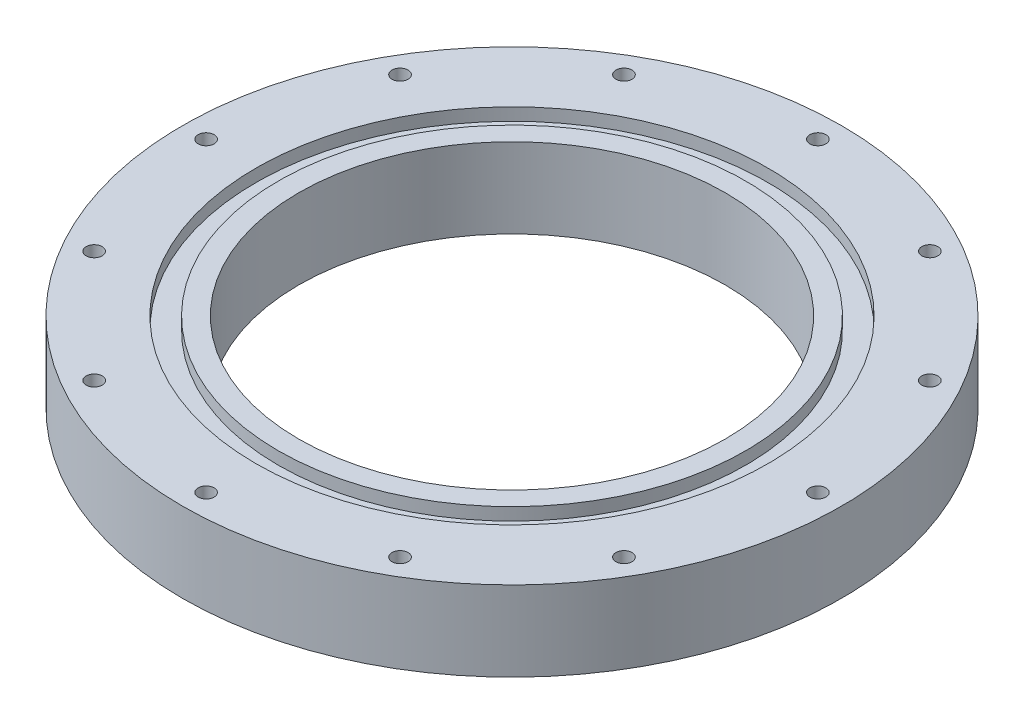
ISO-10303-21;
HEADER;
FILE_DESCRIPTION(('STEP AP214'),'2;1');
FILE_NAME('part.step','',(''),(''),'','','');
FILE_SCHEMA(('AUTOMOTIVE_DESIGN { 1 0 10303 214 1 1 1 1 }'));
ENDSEC;
DATA;
#1=APPLICATION_CONTEXT('core data for automotive mechanical design processes');
#2=APPLICATION_PROTOCOL_DEFINITION('international standard','automotive_design',2000,#1);
#3=PRODUCT_CONTEXT('',#1,'mechanical');
#4=PRODUCT('Part','Part','',(#3));
#5=PRODUCT_RELATED_PRODUCT_CATEGORY('part','',(#4));
#6=PRODUCT_DEFINITION_FORMATION('','',#4);
#7=PRODUCT_DEFINITION_CONTEXT('part definition',#1,'design');
#8=PRODUCT_DEFINITION('design','',#6,#7);
#9=PRODUCT_DEFINITION_SHAPE('','',#8);
#10=(LENGTH_UNIT() NAMED_UNIT(*) SI_UNIT(.MILLI.,.METRE.));
#11=(NAMED_UNIT(*) PLANE_ANGLE_UNIT() SI_UNIT($,.RADIAN.));
#12=(NAMED_UNIT(*) SI_UNIT($,.STERADIAN.) SOLID_ANGLE_UNIT());
#13=UNCERTAINTY_MEASURE_WITH_UNIT(LENGTH_MEASURE(1.E-05),#10,'distance_accuracy_value','');
#14=(GEOMETRIC_REPRESENTATION_CONTEXT(3) GLOBAL_UNCERTAINTY_ASSIGNED_CONTEXT((#13)) GLOBAL_UNIT_ASSIGNED_CONTEXT((#10,
#11,#12)) REPRESENTATION_CONTEXT('',''));
#15=CARTESIAN_POINT('',(0.,0.,0.));
#16=DIRECTION('',(0.,0.,1.));
#17=DIRECTION('',(1.,0.,0.));
#18=AXIS2_PLACEMENT_3D('',#15,#16,#17);
#19=CARTESIAN_POINT('',(0.,25.4,0.));
#20=DIRECTION('',(0.,1.,0.));
#21=DIRECTION('',(0.,0.,1.));
#22=AXIS2_PLACEMENT_3D('',#19,#20,#21);
#23=PLANE('',#22);
#24=CARTESIAN_POINT('',(0.,25.4,0.));
#25=DIRECTION('',(0.,1.,0.));
#26=DIRECTION('',(0.,0.,1.));
#27=AXIS2_PLACEMENT_3D('',#24,#25,#26);
#28=CIRCLE('',#27,67.818);
#29=CARTESIAN_POINT('',(0.,25.4,67.818));
#30=VERTEX_POINT('',#29);
#31=EDGE_CURVE('E52',#30,#30,#28,.T.);
#32=ORIENTED_EDGE('',*,*,#31,.F.);
#33=EDGE_LOOP('',(#32));
#34=FACE_BOUND('',#33,.T.);
#35=CARTESIAN_POINT('',(0.,25.4,0.));
#36=DIRECTION('',(0.,1.,0.));
#37=DIRECTION('',(0.,0.,1.));
#38=AXIS2_PLACEMENT_3D('',#35,#36,#37);
#39=CIRCLE('',#38,74.295);
#40=CARTESIAN_POINT('',(0.,25.4,74.295));
#41=VERTEX_POINT('',#40);
#42=EDGE_CURVE('E70',#41,#41,#39,.T.);
#43=ORIENTED_EDGE('',*,*,#42,.T.);
#44=EDGE_LOOP('',(#43));
#45=FACE_BOUND('',#44,.T.);
#46=ADVANCED_FACE('F38',(#34,#45),#23,.T.);
#47=CARTESIAN_POINT('',(84.2211870243877,25.4,48.6251249999998));
#48=DIRECTION('',(0.,1.,0.));
#49=DIRECTION('',(0.86602540378444,0.,0.499999999999998));
#50=AXIS2_PLACEMENT_3D('',#47,#48,#49);
#51=CIRCLE('',#50,2.55269999999999);
#52=CARTESIAN_POINT('',(86.4318900726283,25.4,49.9014749999998));
#53=VERTEX_POINT('',#52);
#54=EDGE_CURVE('E148',#53,#53,#51,.T.);
#55=ORIENTED_EDGE('',*,*,#54,.F.);
#56=EDGE_LOOP('',(#55));
#57=FACE_BOUND('',#56,.T.);
#58=CARTESIAN_POINT('',(97.25025,25.4,-3.39547433072829E-13));
#59=DIRECTION('',(0.,1.,0.));
#60=DIRECTION('',(1.,0.,0.));
#61=AXIS2_PLACEMENT_3D('',#58,#59,#60);
#62=CIRCLE('',#61,2.55269999999999);
#63=CARTESIAN_POINT('',(99.80295,25.4,-3.48460137486494E-13));
#64=VERTEX_POINT('',#63);
#65=EDGE_CURVE('E140',#64,#64,#62,.T.);
#66=ORIENTED_EDGE('',*,*,#65,.F.);
#67=EDGE_LOOP('',(#66));
#68=FACE_BOUND('',#67,.T.);
#69=CARTESIAN_POINT('',(84.2211870243874,25.4,-48.6251250000004));
#70=DIRECTION('',(0.,1.,0.));
#71=DIRECTION('',(0.866025403784436,0.,-0.500000000000004));
#72=AXIS2_PLACEMENT_3D('',#69,#70,#71);
#73=CIRCLE('',#72,2.55269999999999);
#74=CARTESIAN_POINT('',(86.4318900726279,25.4,-49.9014750000004));
#75=VERTEX_POINT('',#74);
#76=EDGE_CURVE('E132',#75,#75,#73,.T.);
#77=ORIENTED_EDGE('',*,*,#76,.F.);
#78=EDGE_LOOP('',(#77));
#79=FACE_BOUND('',#78,.T.);
#80=CARTESIAN_POINT('',(48.6251249999995,25.4,-84.2211870243879));
#81=DIRECTION('',(0.,1.,0.));
#82=DIRECTION('',(0.499999999999995,0.,-0.866025403784442));
#83=AXIS2_PLACEMENT_3D('',#80,#81,#82);
#84=CIRCLE('',#83,2.55269999999999);
#85=CARTESIAN_POINT('',(49.9014749999995,25.4,-86.4318900726284));
#86=VERTEX_POINT('',#85);
#87=EDGE_CURVE('E124',#86,#86,#84,.T.);
#88=ORIENTED_EDGE('',*,*,#87,.F.);
#89=EDGE_LOOP('',(#88));
#90=FACE_BOUND('',#89,.T.);
#91=CARTESIAN_POINT('',(0.,25.4,-97.25025));
#92=DIRECTION('',(0.,1.,0.));
#93=DIRECTION('',(0.,0.,-1.));
#94=AXIS2_PLACEMENT_3D('',#91,#92,#93);
#95=CIRCLE('',#94,2.55269999999999);
#96=CARTESIAN_POINT('',(0.,25.4,-99.80295));
#97=VERTEX_POINT('',#96);
#98=EDGE_CURVE('E116',#97,#97,#95,.T.);
#99=ORIENTED_EDGE('',*,*,#98,.F.);
#100=EDGE_LOOP('',(#99));
#101=FACE_BOUND('',#100,.T.);
#102=CARTESIAN_POINT('',(-48.6251250000007,25.4,-84.2211870243872));
#103=DIRECTION('',(0.,1.,0.));
#104=DIRECTION('',(-0.500000000000007,0.,-0.866025403784435));
#105=AXIS2_PLACEMENT_3D('',#102,#103,#104);
#106=CIRCLE('',#105,2.55269999999999);
#107=CARTESIAN_POINT('',(-49.9014750000007,25.4,-86.4318900726277));
#108=VERTEX_POINT('',#107);
#109=EDGE_CURVE('E108',#108,#108,#106,.T.);
#110=ORIENTED_EDGE('',*,*,#109,.F.);
#111=EDGE_LOOP('',(#110));
#112=FACE_BOUND('',#111,.T.);
#113=CARTESIAN_POINT('',(-84.2211870243881,25.4,-48.6251249999992));
#114=DIRECTION('',(0.,1.,0.));
#115=DIRECTION('',(-0.866025403784443,0.,-0.499999999999992));
#116=AXIS2_PLACEMENT_3D('',#113,#114,#115);
#117=CIRCLE('',#116,2.55269999999999);
#118=CARTESIAN_POINT('',(-86.4318900726286,25.4,-49.9014749999992));
#119=VERTEX_POINT('',#118);
#120=EDGE_CURVE('E98',#119,#119,#117,.T.);
#121=ORIENTED_EDGE('',*,*,#120,.F.);
#122=EDGE_LOOP('',(#121));
#123=FACE_BOUND('',#122,.T.);
#124=CARTESIAN_POINT('',(-97.25025,25.4,1.01864229921849E-12));
#125=DIRECTION('',(0.,1.,0.));
#126=DIRECTION('',(-1.,0.,0.));
#127=AXIS2_PLACEMENT_3D('',#124,#125,#126);
#128=CIRCLE('',#127,2.55269999999999);
#129=CARTESIAN_POINT('',(-99.80295,25.4,1.04538041245948E-12));
#130=VERTEX_POINT('',#129);
#131=EDGE_CURVE('E99',#130,#130,#128,.T.);
#132=ORIENTED_EDGE('',*,*,#131,.F.);
#133=EDGE_LOOP('',(#132));
#134=FACE_BOUND('',#133,.T.);
#135=CARTESIAN_POINT('',(-84.221187024387,25.4,48.625125000001));
#136=DIRECTION('',(0.,1.,0.));
#137=DIRECTION('',(-0.866025403784433,0.,0.50000000000001));
#138=AXIS2_PLACEMENT_3D('',#135,#136,#137);
#139=CIRCLE('',#138,2.55269999999999);
#140=CARTESIAN_POINT('',(-86.4318900726276,25.4,49.901475000001));
#141=VERTEX_POINT('',#140);
#142=EDGE_CURVE('E162',#141,#141,#139,.T.);
#143=ORIENTED_EDGE('',*,*,#142,.F.);
#144=EDGE_LOOP('',(#143));
#145=FACE_BOUND('',#144,.T.);
#146=CARTESIAN_POINT('',(-48.6251249999989,25.4,84.2211870243882));
#147=DIRECTION('',(0.,1.,0.));
#148=DIRECTION('',(-0.499999999999989,0.,0.866025403784445));
#149=AXIS2_PLACEMENT_3D('',#146,#147,#148);
#150=CIRCLE('',#149,2.55269999999999);
#151=CARTESIAN_POINT('',(-49.9014749999989,25.4,86.4318900726288));
#152=VERTEX_POINT('',#151);
#153=EDGE_CURVE('E163',#152,#152,#150,.T.);
#154=ORIENTED_EDGE('',*,*,#153,.F.);
#155=EDGE_LOOP('',(#154));
#156=FACE_BOUND('',#155,.T.);
#157=CARTESIAN_POINT('',(48.6251250000001,25.4,84.2211870243875));
#158=DIRECTION('',(0.,1.,0.));
#159=DIRECTION('',(0.500000000000001,0.,0.866025403784438));
#160=AXIS2_PLACEMENT_3D('',#157,#158,#159);
#161=CIRCLE('',#160,2.55269999999999);
#162=CARTESIAN_POINT('',(49.9014750000001,25.4,86.4318900726281));
#163=VERTEX_POINT('',#162);
#164=EDGE_CURVE('E89',#163,#163,#161,.T.);
#165=ORIENTED_EDGE('',*,*,#164,.F.);
#166=EDGE_LOOP('',(#165));
#167=FACE_BOUND('',#166,.T.);
#168=CARTESIAN_POINT('',(0.,25.4,97.25025));
#169=DIRECTION('',(0.,1.,0.));
#170=DIRECTION('',(0.,0.,1.));
#171=AXIS2_PLACEMENT_3D('',#168,#169,#170);
#172=CIRCLE('',#171,2.55269999999999);
#173=CARTESIAN_POINT('',(0.,25.4,99.80295));
#174=VERTEX_POINT('',#173);
#175=EDGE_CURVE('E81',#174,#174,#172,.T.);
#176=ORIENTED_EDGE('',*,*,#175,.F.);
#177=EDGE_LOOP('',(#176));
#178=FACE_BOUND('',#177,.T.);
#179=CARTESIAN_POINT('',(0.,25.4,0.));
#180=DIRECTION('',(0.,1.,0.));
#181=DIRECTION('',(0.,0.,1.));
#182=AXIS2_PLACEMENT_3D('',#179,#180,#181);
#183=CIRCLE('',#182,81.407);
#184=CARTESIAN_POINT('',(0.,25.4,81.407));
#185=VERTEX_POINT('',#184);
#186=EDGE_CURVE('E62',#185,#185,#183,.T.);
#187=ORIENTED_EDGE('',*,*,#186,.F.);
#188=EDGE_LOOP('',(#187));
#189=FACE_BOUND('',#188,.T.);
#190=CARTESIAN_POINT('',(0.,25.4,0.));
#191=DIRECTION('',(0.,1.,0.));
#192=DIRECTION('',(0.,0.,1.));
#193=AXIS2_PLACEMENT_3D('',#190,#191,#192);
#194=CIRCLE('',#193,104.775);
#195=CARTESIAN_POINT('',(0.,25.4,104.775));
#196=VERTEX_POINT('',#195);
#197=EDGE_CURVE('E10',#196,#196,#194,.T.);
#198=ORIENTED_EDGE('',*,*,#197,.T.);
#199=EDGE_LOOP('',(#198));
#200=FACE_BOUND('',#199,.T.);
#201=ADVANCED_FACE('F177',(#57,#68,#79,#90,#101,#112,#123,#134,#145,#156,#167,#178,#189,#200),
#23,.T.);
#202=CARTESIAN_POINT('',(0.,0.,0.));
#203=DIRECTION('',(0.,1.,0.));
#204=DIRECTION('',(0.,0.,1.));
#205=AXIS2_PLACEMENT_3D('',#202,#203,#204);
#206=PLANE('',#205);
#207=CARTESIAN_POINT('',(84.2211870243877,0.,48.6251249999998));
#208=DIRECTION('',(0.,1.,0.));
#209=DIRECTION('',(0.,0.,1.));
#210=AXIS2_PLACEMENT_3D('',#207,#208,#209);
#211=CIRCLE('',#210,2.55269999999999);
#212=CARTESIAN_POINT('',(84.2211870243877,0.,51.1778249999998));
#213=VERTEX_POINT('',#212);
#214=EDGE_CURVE('E93',#213,#213,#211,.F.);
#215=ORIENTED_EDGE('',*,*,#214,.F.);
#216=EDGE_LOOP('',(#215));
#217=FACE_BOUND('',#216,.T.);
#218=CARTESIAN_POINT('',(97.25025,0.,-3.39547433072829E-13));
#219=DIRECTION('',(0.,1.,0.));
#220=DIRECTION('',(0.,0.,1.));
#221=AXIS2_PLACEMENT_3D('',#218,#219,#220);
#222=CIRCLE('',#221,2.55269999999999);
#223=CARTESIAN_POINT('',(97.25025,0.,2.55269999999965));
#224=VERTEX_POINT('',#223);
#225=EDGE_CURVE('E144',#224,#224,#222,.F.);
#226=ORIENTED_EDGE('',*,*,#225,.F.);
#227=EDGE_LOOP('',(#226));
#228=FACE_BOUND('',#227,.T.);
#229=CARTESIAN_POINT('',(84.2211870243874,0.,-48.6251250000004));
#230=DIRECTION('',(0.,1.,0.));
#231=DIRECTION('',(0.,0.,1.));
#232=AXIS2_PLACEMENT_3D('',#229,#230,#231);
#233=CIRCLE('',#232,2.55269999999999);
#234=CARTESIAN_POINT('',(84.2211870243874,0.,-46.0724250000004));
#235=VERTEX_POINT('',#234);
#236=EDGE_CURVE('E136',#235,#235,#233,.F.);
#237=ORIENTED_EDGE('',*,*,#236,.F.);
#238=EDGE_LOOP('',(#237));
#239=FACE_BOUND('',#238,.T.);
#240=CARTESIAN_POINT('',(48.6251249999995,0.,-84.2211870243879));
#241=DIRECTION('',(0.,1.,0.));
#242=DIRECTION('',(0.,0.,1.));
#243=AXIS2_PLACEMENT_3D('',#240,#241,#242);
#244=CIRCLE('',#243,2.55269999999999);
#245=CARTESIAN_POINT('',(48.6251249999995,0.,-81.6684870243879));
#246=VERTEX_POINT('',#245);
#247=EDGE_CURVE('E128',#246,#246,#244,.F.);
#248=ORIENTED_EDGE('',*,*,#247,.F.);
#249=EDGE_LOOP('',(#248));
#250=FACE_BOUND('',#249,.T.);
#251=CARTESIAN_POINT('',(0.,0.,-97.25025));
#252=DIRECTION('',(0.,1.,0.));
#253=DIRECTION('',(0.,0.,1.));
#254=AXIS2_PLACEMENT_3D('',#251,#252,#253);
#255=CIRCLE('',#254,2.55269999999999);
#256=CARTESIAN_POINT('',(0.,0.,-94.69755));
#257=VERTEX_POINT('',#256);
#258=EDGE_CURVE('E120',#257,#257,#255,.F.);
#259=ORIENTED_EDGE('',*,*,#258,.F.);
#260=EDGE_LOOP('',(#259));
#261=FACE_BOUND('',#260,.T.);
#262=CARTESIAN_POINT('',(-48.6251250000007,0.,-84.2211870243872));
#263=DIRECTION('',(0.,1.,0.));
#264=DIRECTION('',(0.,0.,1.));
#265=AXIS2_PLACEMENT_3D('',#262,#263,#264);
#266=CIRCLE('',#265,2.55269999999999);
#267=CARTESIAN_POINT('',(-48.6251250000007,0.,-81.6684870243872));
#268=VERTEX_POINT('',#267);
#269=EDGE_CURVE('E112',#268,#268,#266,.F.);
#270=ORIENTED_EDGE('',*,*,#269,.F.);
#271=EDGE_LOOP('',(#270));
#272=FACE_BOUND('',#271,.T.);
#273=CARTESIAN_POINT('',(-84.2211870243881,0.,-48.6251249999992));
#274=DIRECTION('',(0.,1.,0.));
#275=DIRECTION('',(0.,0.,1.));
#276=AXIS2_PLACEMENT_3D('',#273,#274,#275);
#277=CIRCLE('',#276,2.55269999999999);
#278=CARTESIAN_POINT('',(-84.2211870243881,0.,-46.0724249999992));
#279=VERTEX_POINT('',#278);
#280=EDGE_CURVE('E104',#279,#279,#277,.F.);
#281=ORIENTED_EDGE('',*,*,#280,.F.);
#282=EDGE_LOOP('',(#281));
#283=FACE_BOUND('',#282,.T.);
#284=CARTESIAN_POINT('',(-97.25025,0.,1.01864229921849E-12));
#285=DIRECTION('',(0.,1.,0.));
#286=DIRECTION('',(0.,0.,1.));
#287=AXIS2_PLACEMENT_3D('',#284,#285,#286);
#288=CIRCLE('',#287,2.55269999999999);
#289=CARTESIAN_POINT('',(-97.25025,0.,2.55270000000101));
#290=VERTEX_POINT('',#289);
#291=EDGE_CURVE('E94',#290,#290,#288,.F.);
#292=ORIENTED_EDGE('',*,*,#291,.F.);
#293=EDGE_LOOP('',(#292));
#294=FACE_BOUND('',#293,.T.);
#295=CARTESIAN_POINT('',(-84.221187024387,0.,48.625125000001));
#296=DIRECTION('',(0.,1.,0.));
#297=DIRECTION('',(0.,0.,1.));
#298=AXIS2_PLACEMENT_3D('',#295,#296,#297);
#299=CIRCLE('',#298,2.55269999999999);
#300=CARTESIAN_POINT('',(-84.221187024387,0.,51.177825000001));
#301=VERTEX_POINT('',#300);
#302=EDGE_CURVE('E103',#301,#301,#299,.F.);
#303=ORIENTED_EDGE('',*,*,#302,.F.);
#304=EDGE_LOOP('',(#303));
#305=FACE_BOUND('',#304,.T.);
#306=CARTESIAN_POINT('',(-48.6251249999989,0.,84.2211870243882));
#307=DIRECTION('',(0.,1.,0.));
#308=DIRECTION('',(0.,0.,1.));
#309=AXIS2_PLACEMENT_3D('',#306,#307,#308);
#310=CIRCLE('',#309,2.55269999999999);
#311=CARTESIAN_POINT('',(-48.6251249999989,0.,86.7738870243882));
#312=VERTEX_POINT('',#311);
#313=EDGE_CURVE('E158',#312,#312,#310,.F.);
#314=ORIENTED_EDGE('',*,*,#313,.F.);
#315=EDGE_LOOP('',(#314));
#316=FACE_BOUND('',#315,.T.);
#317=CARTESIAN_POINT('',(48.6251250000001,0.,84.2211870243875));
#318=DIRECTION('',(0.,1.,0.));
#319=DIRECTION('',(0.,0.,1.));
#320=AXIS2_PLACEMENT_3D('',#317,#318,#319);
#321=CIRCLE('',#320,2.55269999999999);
#322=CARTESIAN_POINT('',(48.6251250000001,0.,86.7738870243875));
#323=VERTEX_POINT('',#322);
#324=EDGE_CURVE('E85',#323,#323,#321,.F.);
#325=ORIENTED_EDGE('',*,*,#324,.F.);
#326=EDGE_LOOP('',(#325));
#327=FACE_BOUND('',#326,.T.);
#328=CARTESIAN_POINT('',(0.,0.,97.25025));
#329=DIRECTION('',(0.,1.,0.));
#330=DIRECTION('',(0.,0.,1.));
#331=AXIS2_PLACEMENT_3D('',#328,#329,#330);
#332=CIRCLE('',#331,2.55269999999999);
#333=CARTESIAN_POINT('',(0.,0.,99.80295));
#334=VERTEX_POINT('',#333);
#335=EDGE_CURVE('E74',#334,#334,#332,.F.);
#336=ORIENTED_EDGE('',*,*,#335,.F.);
#337=EDGE_LOOP('',(#336));
#338=FACE_BOUND('',#337,.T.);
#339=CARTESIAN_POINT('',(0.,0.,0.));
#340=DIRECTION('',(0.,1.,0.));
#341=DIRECTION('',(0.,0.,1.));
#342=AXIS2_PLACEMENT_3D('',#339,#340,#341);
#343=CIRCLE('',#342,104.775);
#344=CARTESIAN_POINT('',(0.,0.,104.775));
#345=VERTEX_POINT('',#344);
#346=EDGE_CURVE('E42',#345,#345,#343,.T.);
#347=ORIENTED_EDGE('',*,*,#346,.F.);
#348=EDGE_LOOP('',(#347));
#349=FACE_BOUND('',#348,.T.);
#350=CARTESIAN_POINT('',(0.,0.,0.));
#351=DIRECTION('',(0.,1.,0.));
#352=DIRECTION('',(0.,0.,1.));
#353=AXIS2_PLACEMENT_3D('',#350,#351,#352);
#354=CIRCLE('',#353,67.818);
#355=CARTESIAN_POINT('',(0.,0.,67.818));
#356=VERTEX_POINT('',#355);
#357=EDGE_CURVE('E54',#356,#356,#354,.T.);
#358=ORIENTED_EDGE('',*,*,#357,.T.);
#359=EDGE_LOOP('',(#358));
#360=FACE_BOUND('',#359,.T.);
#361=ADVANCED_FACE('F180',(#217,#228,#239,#250,#261,#272,#283,#294,#305,#316,#327,#338,#349,
#360),#206,.F.);
#362=CARTESIAN_POINT('',(0.,25.4,0.));
#363=DIRECTION('',(0.,-1.,0.));
#364=DIRECTION('',(0.,0.,-1.));
#365=AXIS2_PLACEMENT_3D('',#362,#363,#364);
#366=CYLINDRICAL_SURFACE('',#365,104.775);
#367=ORIENTED_EDGE('',*,*,#197,.F.);
#368=EDGE_LOOP('',(#367));
#369=FACE_BOUND('',#368,.T.);
#370=ORIENTED_EDGE('',*,*,#346,.T.);
#371=EDGE_LOOP('',(#370));
#372=FACE_BOUND('',#371,.T.);
#373=ADVANCED_FACE('F40',(#369,#372),#366,.T.);
#374=CARTESIAN_POINT('',(0.,25.4,0.));
#375=DIRECTION('',(0.,-1.,0.));
#376=DIRECTION('',(0.,0.,-1.));
#377=AXIS2_PLACEMENT_3D('',#374,#375,#376);
#378=CYLINDRICAL_SURFACE('',#377,67.818);
#379=ORIENTED_EDGE('',*,*,#31,.T.);
#380=EDGE_LOOP('',(#379));
#381=FACE_BOUND('',#380,.T.);
#382=ORIENTED_EDGE('',*,*,#357,.F.);
#383=EDGE_LOOP('',(#382));
#384=FACE_BOUND('',#383,.T.);
#385=ADVANCED_FACE('F194',(#381,#384),#378,.F.);
#386=CARTESIAN_POINT('',(0.,21.4122,0.));
#387=DIRECTION('',(0.,1.,0.));
#388=DIRECTION('',(0.,0.,1.));
#389=AXIS2_PLACEMENT_3D('',#386,#387,#388);
#390=CYLINDRICAL_SURFACE('',#389,81.407);
#391=CARTESIAN_POINT('',(0.,21.4122,0.));
#392=DIRECTION('',(0.,1.,0.));
#393=DIRECTION('',(0.,0.,1.));
#394=AXIS2_PLACEMENT_3D('',#391,#392,#393);
#395=CIRCLE('',#394,81.407);
#396=CARTESIAN_POINT('',(0.,21.4122,81.407));
#397=VERTEX_POINT('',#396);
#398=EDGE_CURVE('E58',#397,#397,#395,.T.);
#399=ORIENTED_EDGE('',*,*,#398,.F.);
#400=EDGE_LOOP('',(#399));
#401=FACE_BOUND('',#400,.T.);
#402=ORIENTED_EDGE('',*,*,#186,.T.);
#403=EDGE_LOOP('',(#402));
#404=FACE_BOUND('',#403,.T.);
#405=ADVANCED_FACE('F191',(#401,#404),#390,.F.);
#406=CARTESIAN_POINT('',(0.,21.4122,0.));
#407=DIRECTION('',(0.,1.,0.));
#408=DIRECTION('',(0.,0.,1.));
#409=AXIS2_PLACEMENT_3D('',#406,#407,#408);
#410=PLANE('',#409);
#411=CARTESIAN_POINT('',(0.,21.4122,0.));
#412=DIRECTION('',(0.,1.,0.));
#413=DIRECTION('',(0.,0.,1.));
#414=AXIS2_PLACEMENT_3D('',#411,#412,#413);
#415=CIRCLE('',#414,74.295);
#416=CARTESIAN_POINT('',(0.,21.4122,74.295));
#417=VERTEX_POINT('',#416);
#418=EDGE_CURVE('E66',#417,#417,#415,.T.);
#419=ORIENTED_EDGE('',*,*,#418,.F.);
#420=EDGE_LOOP('',(#419));
#421=FACE_BOUND('',#420,.T.);
#422=ORIENTED_EDGE('',*,*,#398,.T.);
#423=EDGE_LOOP('',(#422));
#424=FACE_BOUND('',#423,.T.);
#425=ADVANCED_FACE('F193',(#421,#424),#410,.T.);
#426=CARTESIAN_POINT('',(0.,21.4122,0.));
#427=DIRECTION('',(0.,1.,0.));
#428=DIRECTION('',(0.,0.,1.));
#429=AXIS2_PLACEMENT_3D('',#426,#427,#428);
#430=CYLINDRICAL_SURFACE('',#429,74.295);
#431=ORIENTED_EDGE('',*,*,#418,.T.);
#432=EDGE_LOOP('',(#431));
#433=FACE_BOUND('',#432,.T.);
#434=ORIENTED_EDGE('',*,*,#42,.F.);
#435=EDGE_LOOP('',(#434));
#436=FACE_BOUND('',#435,.T.);
#437=ADVANCED_FACE('F201',(#433,#436),#430,.T.);
#438=CARTESIAN_POINT('',(0.,-7.22012592133957,97.25025));
#439=DIRECTION('',(0.,1.,0.));
#440=DIRECTION('',(0.,0.,1.));
#441=AXIS2_PLACEMENT_3D('',#438,#439,#440);
#442=CYLINDRICAL_SURFACE('',#441,2.55269999999999);
#443=ORIENTED_EDGE('',*,*,#335,.T.);
#444=EDGE_LOOP('',(#443));
#445=FACE_BOUND('',#444,.T.);
#446=ORIENTED_EDGE('',*,*,#175,.T.);
#447=EDGE_LOOP('',(#446));
#448=FACE_BOUND('',#447,.T.);
#449=ADVANCED_FACE('F249',(#445,#448),#442,.F.);
#450=CARTESIAN_POINT('',(48.6251250000001,-7.22012592133957,84.2211870243875));
#451=DIRECTION('',(0.,1.,0.));
#452=DIRECTION('',(0.,0.,1.));
#453=AXIS2_PLACEMENT_3D('',#450,#451,#452);
#454=CYLINDRICAL_SURFACE('',#453,2.55269999999999);
#455=ORIENTED_EDGE('',*,*,#324,.T.);
#456=EDGE_LOOP('',(#455));
#457=FACE_BOUND('',#456,.T.);
#458=ORIENTED_EDGE('',*,*,#164,.T.);
#459=EDGE_LOOP('',(#458));
#460=FACE_BOUND('',#459,.T.);
#461=ADVANCED_FACE('F252',(#457,#460),#454,.F.);
#462=CARTESIAN_POINT('',(-48.6251249999989,-7.22012592133957,84.2211870243882));
#463=DIRECTION('',(0.,1.,0.));
#464=DIRECTION('',(0.,0.,1.));
#465=AXIS2_PLACEMENT_3D('',#462,#463,#464);
#466=CYLINDRICAL_SURFACE('',#465,2.55269999999999);
#467=ORIENTED_EDGE('',*,*,#313,.T.);
#468=EDGE_LOOP('',(#467));
#469=FACE_BOUND('',#468,.T.);
#470=ORIENTED_EDGE('',*,*,#153,.T.);
#471=EDGE_LOOP('',(#470));
#472=FACE_BOUND('',#471,.T.);
#473=ADVANCED_FACE('F258',(#469,#472),#466,.F.);
#474=CARTESIAN_POINT('',(-84.221187024387,-7.22012592133957,48.625125000001));
#475=DIRECTION('',(0.,1.,0.));
#476=DIRECTION('',(0.,0.,1.));
#477=AXIS2_PLACEMENT_3D('',#474,#475,#476);
#478=CYLINDRICAL_SURFACE('',#477,2.55269999999999);
#479=ORIENTED_EDGE('',*,*,#302,.T.);
#480=EDGE_LOOP('',(#479));
#481=FACE_BOUND('',#480,.T.);
#482=ORIENTED_EDGE('',*,*,#142,.T.);
#483=EDGE_LOOP('',(#482));
#484=FACE_BOUND('',#483,.T.);
#485=ADVANCED_FACE('F175',(#481,#484),#478,.F.);
#486=CARTESIAN_POINT('',(-97.25025,-7.22012592133957,1.01864229921849E-12));
#487=DIRECTION('',(0.,1.,0.));
#488=DIRECTION('',(0.,0.,1.));
#489=AXIS2_PLACEMENT_3D('',#486,#487,#488);
#490=CYLINDRICAL_SURFACE('',#489,2.55269999999999);
#491=ORIENTED_EDGE('',*,*,#291,.T.);
#492=EDGE_LOOP('',(#491));
#493=FACE_BOUND('',#492,.T.);
#494=ORIENTED_EDGE('',*,*,#131,.T.);
#495=EDGE_LOOP('',(#494));
#496=FACE_BOUND('',#495,.T.);
#497=ADVANCED_FACE('F264',(#493,#496),#490,.F.);
#498=CARTESIAN_POINT('',(-84.2211870243881,-7.22012592133957,-48.6251249999992));
#499=DIRECTION('',(0.,1.,0.));
#500=DIRECTION('',(0.,0.,1.));
#501=AXIS2_PLACEMENT_3D('',#498,#499,#500);
#502=CYLINDRICAL_SURFACE('',#501,2.55269999999999);
#503=ORIENTED_EDGE('',*,*,#280,.T.);
#504=EDGE_LOOP('',(#503));
#505=FACE_BOUND('',#504,.T.);
#506=ORIENTED_EDGE('',*,*,#120,.T.);
#507=EDGE_LOOP('',(#506));
#508=FACE_BOUND('',#507,.T.);
#509=ADVANCED_FACE('F267',(#505,#508),#502,.F.);
#510=CARTESIAN_POINT('',(-48.6251250000007,-7.22012592133957,-84.2211870243872));
#511=DIRECTION('',(0.,1.,0.));
#512=DIRECTION('',(0.,0.,1.));
#513=AXIS2_PLACEMENT_3D('',#510,#511,#512);
#514=CYLINDRICAL_SURFACE('',#513,2.55269999999999);
#515=ORIENTED_EDGE('',*,*,#269,.T.);
#516=EDGE_LOOP('',(#515));
#517=FACE_BOUND('',#516,.T.);
#518=ORIENTED_EDGE('',*,*,#109,.T.);
#519=EDGE_LOOP('',(#518));
#520=FACE_BOUND('',#519,.T.);
#521=ADVANCED_FACE('F271',(#517,#520),#514,.F.);
#522=CARTESIAN_POINT('',(0.,-7.22012592133957,-97.25025));
#523=DIRECTION('',(0.,1.,0.));
#524=DIRECTION('',(0.,0.,1.));
#525=AXIS2_PLACEMENT_3D('',#522,#523,#524);
#526=CYLINDRICAL_SURFACE('',#525,2.55269999999999);
#527=ORIENTED_EDGE('',*,*,#258,.T.);
#528=EDGE_LOOP('',(#527));
#529=FACE_BOUND('',#528,.T.);
#530=ORIENTED_EDGE('',*,*,#98,.T.);
#531=EDGE_LOOP('',(#530));
#532=FACE_BOUND('',#531,.T.);
#533=ADVANCED_FACE('F275',(#529,#532),#526,.F.);
#534=CARTESIAN_POINT('',(48.6251249999995,-7.22012592133957,-84.2211870243879));
#535=DIRECTION('',(0.,1.,0.));
#536=DIRECTION('',(0.,0.,1.));
#537=AXIS2_PLACEMENT_3D('',#534,#535,#536);
#538=CYLINDRICAL_SURFACE('',#537,2.55269999999999);
#539=ORIENTED_EDGE('',*,*,#247,.T.);
#540=EDGE_LOOP('',(#539));
#541=FACE_BOUND('',#540,.T.);
#542=ORIENTED_EDGE('',*,*,#87,.T.);
#543=EDGE_LOOP('',(#542));
#544=FACE_BOUND('',#543,.T.);
#545=ADVANCED_FACE('F279',(#541,#544),#538,.F.);
#546=CARTESIAN_POINT('',(84.2211870243874,-7.22012592133957,-48.6251250000004));
#547=DIRECTION('',(0.,1.,0.));
#548=DIRECTION('',(0.,0.,1.));
#549=AXIS2_PLACEMENT_3D('',#546,#547,#548);
#550=CYLINDRICAL_SURFACE('',#549,2.55269999999999);
#551=ORIENTED_EDGE('',*,*,#236,.T.);
#552=EDGE_LOOP('',(#551));
#553=FACE_BOUND('',#552,.T.);
#554=ORIENTED_EDGE('',*,*,#76,.T.);
#555=EDGE_LOOP('',(#554));
#556=FACE_BOUND('',#555,.T.);
#557=ADVANCED_FACE('F283',(#553,#556),#550,.F.);
#558=CARTESIAN_POINT('',(97.25025,-7.22012592133957,-3.39547433072829E-13));
#559=DIRECTION('',(0.,1.,0.));
#560=DIRECTION('',(0.,0.,1.));
#561=AXIS2_PLACEMENT_3D('',#558,#559,#560);
#562=CYLINDRICAL_SURFACE('',#561,2.55269999999999);
#563=ORIENTED_EDGE('',*,*,#225,.T.);
#564=EDGE_LOOP('',(#563));
#565=FACE_BOUND('',#564,.T.);
#566=ORIENTED_EDGE('',*,*,#65,.T.);
#567=EDGE_LOOP('',(#566));
#568=FACE_BOUND('',#567,.T.);
#569=ADVANCED_FACE('F287',(#565,#568),#562,.F.);
#570=CARTESIAN_POINT('',(84.2211870243877,-7.22012592133957,48.6251249999998));
#571=DIRECTION('',(0.,1.,0.));
#572=DIRECTION('',(0.,0.,1.));
#573=AXIS2_PLACEMENT_3D('',#570,#571,#572);
#574=CYLINDRICAL_SURFACE('',#573,2.55269999999999);
#575=ORIENTED_EDGE('',*,*,#214,.T.);
#576=EDGE_LOOP('',(#575));
#577=FACE_BOUND('',#576,.T.);
#578=ORIENTED_EDGE('',*,*,#54,.T.);
#579=EDGE_LOOP('',(#578));
#580=FACE_BOUND('',#579,.T.);
#581=ADVANCED_FACE('F291',(#577,#580),#574,.F.);
#582=CLOSED_SHELL('',(#46,#201,#361,#373,#385,#405,#425,#437,#449,#461,#473,#485,#497,#509,#521,
#533,#545,#557,#569,#581));
#583=MANIFOLD_SOLID_BREP('B2',#582);
#584=ADVANCED_BREP_SHAPE_REPRESENTATION('',(#18,#583),#14);
#585=SHAPE_DEFINITION_REPRESENTATION(#9,#584);
ENDSEC;
END-ISO-10303-21;
